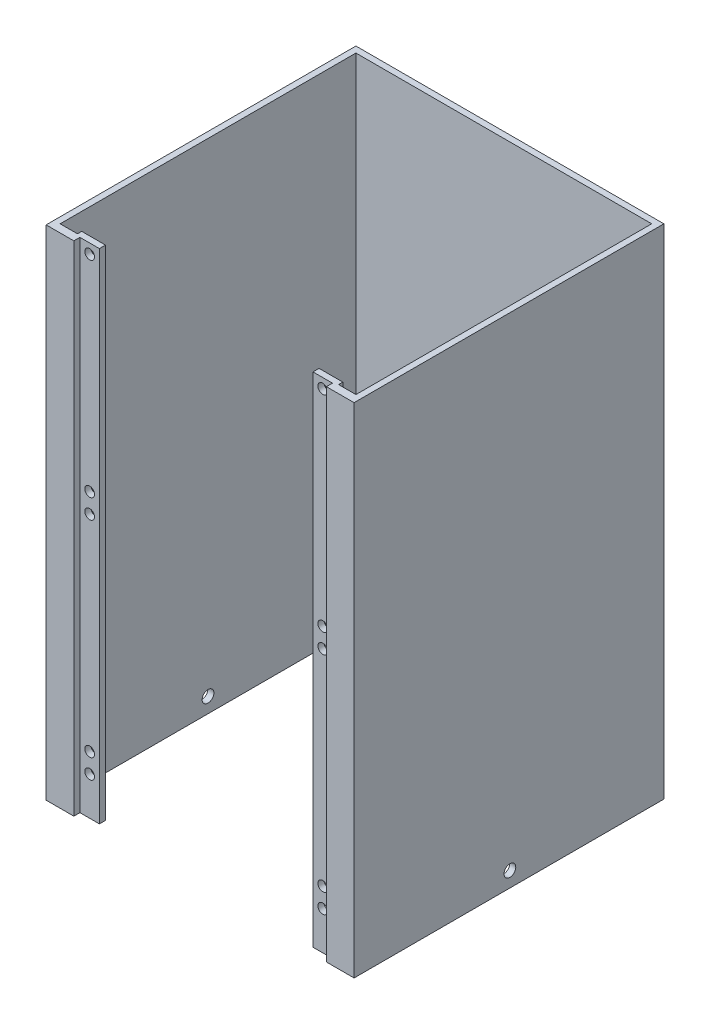
ISO-10303-21;
HEADER;
FILE_DESCRIPTION(('STEP AP214'),'2;1');
FILE_NAME('part.step','',(''),(''),'','','');
FILE_SCHEMA(('AUTOMOTIVE_DESIGN { 1 0 10303 214 1 1 1 1 }'));
ENDSEC;
DATA;
#1=APPLICATION_CONTEXT('core data for automotive mechanical design processes');
#2=APPLICATION_PROTOCOL_DEFINITION('international standard','automotive_design',2000,#1);
#3=PRODUCT_CONTEXT('',#1,'mechanical');
#4=PRODUCT('Part','Part','',(#3));
#5=PRODUCT_RELATED_PRODUCT_CATEGORY('part','',(#4));
#6=PRODUCT_DEFINITION_FORMATION('','',#4);
#7=PRODUCT_DEFINITION_CONTEXT('part definition',#1,'design');
#8=PRODUCT_DEFINITION('design','',#6,#7);
#9=PRODUCT_DEFINITION_SHAPE('','',#8);
#10=(LENGTH_UNIT() NAMED_UNIT(*) SI_UNIT(.MILLI.,.METRE.));
#11=(NAMED_UNIT(*) PLANE_ANGLE_UNIT() SI_UNIT($,.RADIAN.));
#12=(NAMED_UNIT(*) SI_UNIT($,.STERADIAN.) SOLID_ANGLE_UNIT());
#13=UNCERTAINTY_MEASURE_WITH_UNIT(LENGTH_MEASURE(1.E-05),#10,'distance_accuracy_value','');
#14=(GEOMETRIC_REPRESENTATION_CONTEXT(3) GLOBAL_UNCERTAINTY_ASSIGNED_CONTEXT((#13)) GLOBAL_UNIT_ASSIGNED_CONTEXT((#10,
#11,#12)) REPRESENTATION_CONTEXT('',''));
#15=CARTESIAN_POINT('',(0.,0.,0.));
#16=DIRECTION('',(0.,0.,1.));
#17=DIRECTION('',(1.,0.,0.));
#18=AXIS2_PLACEMENT_3D('',#15,#16,#17);
#19=CARTESIAN_POINT('',(9.706,327.5,0.603000000000007));
#20=DIRECTION('',(0.,0.,-1.));
#21=DIRECTION('',(-1.,0.,0.));
#22=AXIS2_PLACEMENT_3D('',#19,#20,#21);
#23=PLANE('',#22);
#24=DIRECTION('',(1.,0.,0.));
#25=VECTOR('',#24,1.);
#26=CARTESIAN_POINT('',(9.706,0.,0.603000000000007));
#27=LINE('',#26,#25);
#28=CARTESIAN_POINT('',(0.,0.,0.603000000000009));
#29=VERTEX_POINT('',#28);
#30=CARTESIAN_POINT('',(9.10300000000001,0.,0.603000000000007));
#31=VERTEX_POINT('',#30);
#32=EDGE_CURVE('E186',#29,#31,#27,.T.);
#33=ORIENTED_EDGE('',*,*,#32,.T.);
#34=DIRECTION('',(0.,1.,0.));
#35=VECTOR('',#34,1.);
#36=CARTESIAN_POINT('',(9.10300000000001,-39.2500000000001,0.603000000000007));
#37=LINE('',#36,#35);
#38=CARTESIAN_POINT('',(9.10300000000001,163.75,0.603000000000007));
#39=VERTEX_POINT('',#38);
#40=EDGE_CURVE('E174',#31,#39,#37,.T.);
#41=ORIENTED_EDGE('',*,*,#40,.T.);
#42=DIRECTION('',(-1.,0.,0.));
#43=VECTOR('',#42,1.);
#44=CARTESIAN_POINT('',(9.706,163.75,0.603000000000007));
#45=LINE('',#44,#43);
#46=CARTESIAN_POINT('',(0.,163.75,0.603000000000008));
#47=VERTEX_POINT('',#46);
#48=EDGE_CURVE('E183',#39,#47,#45,.T.);
#49=ORIENTED_EDGE('',*,*,#48,.T.);
#50=DIRECTION('',(0.,-1.,0.));
#51=VECTOR('',#50,1.);
#52=CARTESIAN_POINT('',(0.,327.5,0.603000000000009));
#53=LINE('',#52,#51);
#54=EDGE_CURVE('E285',#47,#29,#53,.T.);
#55=ORIENTED_EDGE('',*,*,#54,.T.);
#56=EDGE_LOOP('',(#33,#41,#49,#55));
#57=FACE_BOUND('',#56,.T.);
#58=ADVANCED_FACE('F35',(#57),#23,.F.);
#59=CARTESIAN_POINT('',(15.503,327.5,-3.39699999999999));
#60=DIRECTION('',(-1.,0.,0.));
#61=DIRECTION('',(0.,0.,1.));
#62=AXIS2_PLACEMENT_3D('',#59,#60,#61);
#63=PLANE('',#62);
#64=DIRECTION('',(0.,0.,1.));
#65=VECTOR('',#64,1.);
#66=CARTESIAN_POINT('',(15.503,163.75,-3.39699999999999));
#67=LINE('',#66,#65);
#68=CARTESIAN_POINT('',(15.503,163.75,-3.39699999999999));
#69=VERTEX_POINT('',#68);
#70=CARTESIAN_POINT('',(15.503,163.75,-1.4));
#71=VERTEX_POINT('',#70);
#72=EDGE_CURVE('E194',#69,#71,#67,.T.);
#73=ORIENTED_EDGE('',*,*,#72,.T.);
#74=DIRECTION('',(0.,-1.,0.));
#75=VECTOR('',#74,1.);
#76=CARTESIAN_POINT('',(15.503,327.5,-1.4));
#77=LINE('',#76,#75);
#78=CARTESIAN_POINT('',(15.503,0.,-1.4));
#79=VERTEX_POINT('',#78);
#80=EDGE_CURVE('E57',#71,#79,#77,.T.);
#81=ORIENTED_EDGE('',*,*,#80,.T.);
#82=DIRECTION('',(0.,0.,-1.));
#83=VECTOR('',#82,1.);
#84=CARTESIAN_POINT('',(15.503,0.,-3.39699999999999));
#85=LINE('',#84,#83);
#86=CARTESIAN_POINT('',(15.503,0.,-3.39699999999999));
#87=VERTEX_POINT('',#86);
#88=EDGE_CURVE('E240',#79,#87,#85,.T.);
#89=ORIENTED_EDGE('',*,*,#88,.T.);
#90=DIRECTION('',(0.,-1.,0.));
#91=VECTOR('',#90,1.);
#92=CARTESIAN_POINT('',(15.503,327.5,-3.39699999999999));
#93=LINE('',#92,#91);
#94=EDGE_CURVE('E314',#69,#87,#93,.T.);
#95=ORIENTED_EDGE('',*,*,#94,.F.);
#96=EDGE_LOOP('',(#73,#81,#89,#95));
#97=FACE_BOUND('',#96,.T.);
#98=ADVANCED_FACE('F391',(#97),#63,.F.);
#99=CARTESIAN_POINT('',(7.706,327.5,-3.39699999999999));
#100=DIRECTION('',(0.,0.,1.));
#101=DIRECTION('',(1.,0.,0.));
#102=AXIS2_PLACEMENT_3D('',#99,#100,#101);
#103=PLANE('',#102);
#104=CARTESIAN_POINT('',(12.303,12.5999999999999,-3.39699999999999));
#105=DIRECTION('',(0.,0.,1.));
#106=DIRECTION('',(1.,0.,0.));
#107=AXIS2_PLACEMENT_3D('',#104,#105,#106);
#108=CIRCLE('',#107,1.59999999999999);
#109=CARTESIAN_POINT('',(13.903,12.5999999999999,-3.39699999999999));
#110=VERTEX_POINT('',#109);
#111=EDGE_CURVE('E224',#110,#110,#108,.T.);
#112=ORIENTED_EDGE('',*,*,#111,.T.);
#113=EDGE_LOOP('',(#112));
#114=FACE_BOUND('',#113,.T.);
#115=CARTESIAN_POINT('',(12.303,19.,-3.39699999999999));
#116=DIRECTION('',(0.,0.,1.));
#117=DIRECTION('',(1.,0.,0.));
#118=AXIS2_PLACEMENT_3D('',#115,#116,#117);
#119=CIRCLE('',#118,1.59999999999999);
#120=CARTESIAN_POINT('',(13.903,19.,-3.39699999999999));
#121=VERTEX_POINT('',#120);
#122=EDGE_CURVE('E330',#121,#121,#119,.T.);
#123=ORIENTED_EDGE('',*,*,#122,.T.);
#124=EDGE_LOOP('',(#123));
#125=FACE_BOUND('',#124,.T.);
#126=CARTESIAN_POINT('',(12.303,86.575,-3.39699999999999));
#127=DIRECTION('',(0.,0.,1.));
#128=DIRECTION('',(1.,0.,0.));
#129=AXIS2_PLACEMENT_3D('',#126,#127,#128);
#130=CIRCLE('',#129,1.6);
#131=CARTESIAN_POINT('',(13.903,86.575,-3.39699999999999));
#132=VERTEX_POINT('',#131);
#133=EDGE_CURVE('E233',#132,#132,#130,.T.);
#134=ORIENTED_EDGE('',*,*,#133,.T.);
#135=EDGE_LOOP('',(#134));
#136=FACE_BOUND('',#135,.T.);
#137=CARTESIAN_POINT('',(12.303,92.975,-3.39699999999999));
#138=DIRECTION('',(0.,0.,1.));
#139=DIRECTION('',(1.,0.,0.));
#140=AXIS2_PLACEMENT_3D('',#137,#138,#139);
#141=CIRCLE('',#140,1.6);
#142=CARTESIAN_POINT('',(13.903,92.975,-3.39699999999999));
#143=VERTEX_POINT('',#142);
#144=EDGE_CURVE('E321',#143,#143,#141,.T.);
#145=ORIENTED_EDGE('',*,*,#144,.T.);
#146=EDGE_LOOP('',(#145));
#147=FACE_BOUND('',#146,.T.);
#148=CARTESIAN_POINT('',(12.303,160.55,-3.39699999999999));
#149=DIRECTION('',(0.,0.,1.));
#150=DIRECTION('',(1.,0.,0.));
#151=AXIS2_PLACEMENT_3D('',#148,#149,#150);
#152=CIRCLE('',#151,1.59999999999999);
#153=CARTESIAN_POINT('',(13.903,160.55,-3.39699999999999));
#154=VERTEX_POINT('',#153);
#155=EDGE_CURVE('E237',#154,#154,#152,.T.);
#156=ORIENTED_EDGE('',*,*,#155,.T.);
#157=EDGE_LOOP('',(#156));
#158=FACE_BOUND('',#157,.T.);
#159=DIRECTION('',(0.,-1.,0.));
#160=VECTOR('',#159,1.);
#161=CARTESIAN_POINT('',(7.706,327.5,-3.39699999999999));
#162=LINE('',#161,#160);
#163=CARTESIAN_POINT('',(7.706,163.75,-3.39699999999999));
#164=VERTEX_POINT('',#163);
#165=CARTESIAN_POINT('',(7.706,0.,-3.39699999999999));
#166=VERTEX_POINT('',#165);
#167=EDGE_CURVE('E312',#164,#166,#162,.T.);
#168=ORIENTED_EDGE('',*,*,#167,.F.);
#169=DIRECTION('',(1.,0.,0.));
#170=VECTOR('',#169,1.);
#171=CARTESIAN_POINT('',(7.706,163.75,-3.39699999999999));
#172=LINE('',#171,#170);
#173=EDGE_CURVE('E200',#164,#69,#172,.T.);
#174=ORIENTED_EDGE('',*,*,#173,.T.);
#175=ORIENTED_EDGE('',*,*,#94,.T.);
#176=DIRECTION('',(-1.,0.,0.));
#177=VECTOR('',#176,1.);
#178=CARTESIAN_POINT('',(7.706,0.,-3.39699999999999));
#179=LINE('',#178,#177);
#180=EDGE_CURVE('E242',#87,#166,#179,.T.);
#181=ORIENTED_EDGE('',*,*,#180,.T.);
#182=EDGE_LOOP('',(#168,#174,#175,#181));
#183=FACE_BOUND('',#182,.T.);
#184=ADVANCED_FACE('F388',(#114,#125,#136,#147,#158,#183),#103,.F.);
#185=CARTESIAN_POINT('',(7.706,327.5,-2.));
#186=DIRECTION('',(1.,0.,0.));
#187=DIRECTION('',(0.,0.,-1.));
#188=AXIS2_PLACEMENT_3D('',#185,#186,#187);
#189=PLANE('',#188);
#190=DIRECTION('',(0.,-1.,0.));
#191=VECTOR('',#190,1.);
#192=CARTESIAN_POINT('',(7.706,327.5,-2.));
#193=LINE('',#192,#191);
#194=CARTESIAN_POINT('',(7.706,163.75,-2.));
#195=VERTEX_POINT('',#194);
#196=CARTESIAN_POINT('',(7.706,0.,-2.));
#197=VERTEX_POINT('',#196);
#198=EDGE_CURVE('E310',#195,#197,#193,.T.);
#199=ORIENTED_EDGE('',*,*,#198,.F.);
#200=DIRECTION('',(0.,0.,-1.));
#201=VECTOR('',#200,1.);
#202=CARTESIAN_POINT('',(7.706,163.75,-2.));
#203=LINE('',#202,#201);
#204=EDGE_CURVE('E382',#195,#164,#203,.T.);
#205=ORIENTED_EDGE('',*,*,#204,.T.);
#206=ORIENTED_EDGE('',*,*,#167,.T.);
#207=DIRECTION('',(0.,0.,1.));
#208=VECTOR('',#207,1.);
#209=CARTESIAN_POINT('',(7.706,0.,-2.));
#210=LINE('',#209,#208);
#211=EDGE_CURVE('E245',#166,#197,#210,.T.);
#212=ORIENTED_EDGE('',*,*,#211,.T.);
#213=EDGE_LOOP('',(#199,#205,#206,#212));
#214=FACE_BOUND('',#213,.T.);
#215=ADVANCED_FACE('F402',(#214),#189,.F.);
#216=CARTESIAN_POINT('',(2.00000000000001,327.5,-2.));
#217=DIRECTION('',(0.,0.,1.));
#218=DIRECTION('',(1.,0.,0.));
#219=AXIS2_PLACEMENT_3D('',#216,#217,#218);
#220=PLANE('',#219);
#221=DIRECTION('',(0.,-1.,0.));
#222=VECTOR('',#221,1.);
#223=CARTESIAN_POINT('',(2.00000000000001,327.5,-2.));
#224=LINE('',#223,#222);
#225=CARTESIAN_POINT('',(2.00000000000001,163.75,-2.));
#226=VERTEX_POINT('',#225);
#227=CARTESIAN_POINT('',(2.00000000000001,0.,-2.));
#228=VERTEX_POINT('',#227);
#229=EDGE_CURVE('E308',#226,#228,#224,.T.);
#230=ORIENTED_EDGE('',*,*,#229,.F.);
#231=DIRECTION('',(1.,0.,0.));
#232=VECTOR('',#231,1.);
#233=CARTESIAN_POINT('',(2.00000000000001,163.75,-2.));
#234=LINE('',#233,#232);
#235=EDGE_CURVE('E379',#226,#195,#234,.T.);
#236=ORIENTED_EDGE('',*,*,#235,.T.);
#237=ORIENTED_EDGE('',*,*,#198,.T.);
#238=DIRECTION('',(-1.,0.,0.));
#239=VECTOR('',#238,1.);
#240=CARTESIAN_POINT('',(2.00000000000001,0.,-2.));
#241=LINE('',#240,#239);
#242=EDGE_CURVE('E248',#197,#228,#241,.T.);
#243=ORIENTED_EDGE('',*,*,#242,.T.);
#244=EDGE_LOOP('',(#230,#236,#237,#243));
#245=FACE_BOUND('',#244,.T.);
#246=ADVANCED_FACE('F405',(#245),#220,.F.);
#247=CARTESIAN_POINT('',(2.,327.5,-99.206));
#248=DIRECTION('',(-1.,0.,0.));
#249=DIRECTION('',(0.,0.,1.));
#250=AXIS2_PLACEMENT_3D('',#247,#248,#249);
#251=PLANE('',#250);
#252=CARTESIAN_POINT('',(2.00000000000001,4.97599999999998,-50.603));
#253=DIRECTION('',(-1.,0.,0.));
#254=DIRECTION('',(0.,0.,1.));
#255=AXIS2_PLACEMENT_3D('',#252,#253,#254);
#256=CIRCLE('',#255,1.93);
#257=CARTESIAN_POINT('',(2.00000000000001,4.97599999999998,-48.673));
#258=VERTEX_POINT('',#257);
#259=EDGE_CURVE('E213',#258,#258,#256,.T.);
#260=ORIENTED_EDGE('',*,*,#259,.T.);
#261=EDGE_LOOP('',(#260));
#262=FACE_BOUND('',#261,.T.);
#263=DIRECTION('',(0.,-1.,0.));
#264=VECTOR('',#263,1.);
#265=CARTESIAN_POINT('',(2.,327.5,-99.206));
#266=LINE('',#265,#264);
#267=CARTESIAN_POINT('',(2.,163.75,-99.206));
#268=VERTEX_POINT('',#267);
#269=CARTESIAN_POINT('',(2.,0.,-99.206));
#270=VERTEX_POINT('',#269);
#271=EDGE_CURVE('E306',#268,#270,#266,.T.);
#272=ORIENTED_EDGE('',*,*,#271,.F.);
#273=DIRECTION('',(0.,0.,1.));
#274=VECTOR('',#273,1.);
#275=CARTESIAN_POINT('',(2.,163.75,-99.206));
#276=LINE('',#275,#274);
#277=EDGE_CURVE('E376',#268,#226,#276,.T.);
#278=ORIENTED_EDGE('',*,*,#277,.T.);
#279=ORIENTED_EDGE('',*,*,#229,.T.);
#280=DIRECTION('',(0.,0.,-1.));
#281=VECTOR('',#280,1.);
#282=CARTESIAN_POINT('',(2.,0.,-99.206));
#283=LINE('',#282,#281);
#284=EDGE_CURVE('E251',#228,#270,#283,.T.);
#285=ORIENTED_EDGE('',*,*,#284,.T.);
#286=EDGE_LOOP('',(#272,#278,#279,#285));
#287=FACE_BOUND('',#286,.T.);
#288=ADVANCED_FACE('F408',(#262,#287),#251,.F.);
#289=CARTESIAN_POINT('',(99.206,327.5,-99.206));
#290=DIRECTION('',(0.,0.,-1.));
#291=DIRECTION('',(-1.,0.,0.));
#292=AXIS2_PLACEMENT_3D('',#289,#290,#291);
#293=PLANE('',#292);
#294=CARTESIAN_POINT('',(50.603,4.97599999999998,-99.206));
#295=DIRECTION('',(0.,0.,-1.));
#296=DIRECTION('',(-1.,0.,0.));
#297=AXIS2_PLACEMENT_3D('',#294,#295,#296);
#298=CIRCLE('',#297,1.93);
#299=CARTESIAN_POINT('',(48.673,4.97599999999998,-99.206));
#300=VERTEX_POINT('',#299);
#301=EDGE_CURVE('E197',#300,#300,#298,.T.);
#302=ORIENTED_EDGE('',*,*,#301,.T.);
#303=EDGE_LOOP('',(#302));
#304=FACE_BOUND('',#303,.T.);
#305=DIRECTION('',(0.,-1.,0.));
#306=VECTOR('',#305,1.);
#307=CARTESIAN_POINT('',(99.206,327.5,-99.206));
#308=LINE('',#307,#306);
#309=CARTESIAN_POINT('',(99.206,163.75,-99.206));
#310=VERTEX_POINT('',#309);
#311=CARTESIAN_POINT('',(99.206,0.,-99.206));
#312=VERTEX_POINT('',#311);
#313=EDGE_CURVE('E304',#310,#312,#308,.T.);
#314=ORIENTED_EDGE('',*,*,#313,.F.);
#315=DIRECTION('',(-1.,0.,0.));
#316=VECTOR('',#315,1.);
#317=CARTESIAN_POINT('',(99.206,163.75,-99.206));
#318=LINE('',#317,#316);
#319=EDGE_CURVE('E373',#310,#268,#318,.T.);
#320=ORIENTED_EDGE('',*,*,#319,.T.);
#321=ORIENTED_EDGE('',*,*,#271,.T.);
#322=DIRECTION('',(1.,0.,0.));
#323=VECTOR('',#322,1.);
#324=CARTESIAN_POINT('',(99.206,0.,-99.206));
#325=LINE('',#324,#323);
#326=EDGE_CURVE('E254',#270,#312,#325,.T.);
#327=ORIENTED_EDGE('',*,*,#326,.T.);
#328=EDGE_LOOP('',(#314,#320,#321,#327));
#329=FACE_BOUND('',#328,.T.);
#330=ADVANCED_FACE('F412',(#304,#329),#293,.F.);
#331=CARTESIAN_POINT('',(99.206,327.5,-2.));
#332=DIRECTION('',(1.,0.,0.));
#333=DIRECTION('',(0.,0.,-1.));
#334=AXIS2_PLACEMENT_3D('',#331,#332,#333);
#335=PLANE('',#334);
#336=CARTESIAN_POINT('',(99.206,4.97599999999998,-50.603));
#337=DIRECTION('',(1.,0.,0.));
#338=DIRECTION('',(0.,0.,-1.));
#339=AXIS2_PLACEMENT_3D('',#336,#337,#338);
#340=CIRCLE('',#339,1.93);
#341=CARTESIAN_POINT('',(99.206,4.97599999999998,-52.533));
#342=VERTEX_POINT('',#341);
#343=EDGE_CURVE('E210',#342,#342,#340,.T.);
#344=ORIENTED_EDGE('',*,*,#343,.T.);
#345=EDGE_LOOP('',(#344));
#346=FACE_BOUND('',#345,.T.);
#347=DIRECTION('',(0.,-1.,0.));
#348=VECTOR('',#347,1.);
#349=CARTESIAN_POINT('',(99.206,327.5,-2.));
#350=LINE('',#349,#348);
#351=CARTESIAN_POINT('',(99.206,163.75,-2.));
#352=VERTEX_POINT('',#351);
#353=CARTESIAN_POINT('',(99.206,0.,-2.));
#354=VERTEX_POINT('',#353);
#355=EDGE_CURVE('E302',#352,#354,#350,.T.);
#356=ORIENTED_EDGE('',*,*,#355,.F.);
#357=DIRECTION('',(0.,0.,-1.));
#358=VECTOR('',#357,1.);
#359=CARTESIAN_POINT('',(99.206,163.75,-2.));
#360=LINE('',#359,#358);
#361=EDGE_CURVE('E370',#352,#310,#360,.T.);
#362=ORIENTED_EDGE('',*,*,#361,.T.);
#363=ORIENTED_EDGE('',*,*,#313,.T.);
#364=DIRECTION('',(0.,0.,1.));
#365=VECTOR('',#364,1.);
#366=CARTESIAN_POINT('',(99.206,0.,-2.));
#367=LINE('',#366,#365);
#368=EDGE_CURVE('E257',#312,#354,#367,.T.);
#369=ORIENTED_EDGE('',*,*,#368,.T.);
#370=EDGE_LOOP('',(#356,#362,#363,#369));
#371=FACE_BOUND('',#370,.T.);
#372=ADVANCED_FACE('F416',(#346,#371),#335,.F.);
#373=CARTESIAN_POINT('',(93.5,327.5,-2.));
#374=DIRECTION('',(0.,0.,1.));
#375=DIRECTION('',(1.,0.,0.));
#376=AXIS2_PLACEMENT_3D('',#373,#374,#375);
#377=PLANE('',#376);
#378=DIRECTION('',(0.,-1.,0.));
#379=VECTOR('',#378,1.);
#380=CARTESIAN_POINT('',(93.5,327.5,-2.));
#381=LINE('',#380,#379);
#382=CARTESIAN_POINT('',(93.5,163.75,-2.));
#383=VERTEX_POINT('',#382);
#384=CARTESIAN_POINT('',(93.5,0.,-2.));
#385=VERTEX_POINT('',#384);
#386=EDGE_CURVE('E300',#383,#385,#381,.T.);
#387=ORIENTED_EDGE('',*,*,#386,.F.);
#388=DIRECTION('',(1.,0.,0.));
#389=VECTOR('',#388,1.);
#390=CARTESIAN_POINT('',(93.5,163.75,-2.));
#391=LINE('',#390,#389);
#392=EDGE_CURVE('E367',#383,#352,#391,.T.);
#393=ORIENTED_EDGE('',*,*,#392,.T.);
#394=ORIENTED_EDGE('',*,*,#355,.T.);
#395=DIRECTION('',(-1.,0.,0.));
#396=VECTOR('',#395,1.);
#397=CARTESIAN_POINT('',(93.5,0.,-2.));
#398=LINE('',#397,#396);
#399=EDGE_CURVE('E260',#354,#385,#398,.T.);
#400=ORIENTED_EDGE('',*,*,#399,.T.);
#401=EDGE_LOOP('',(#387,#393,#394,#400));
#402=FACE_BOUND('',#401,.T.);
#403=ADVANCED_FACE('F420',(#402),#377,.F.);
#404=CARTESIAN_POINT('',(93.5,327.5,-3.4));
#405=DIRECTION('',(-1.,0.,0.));
#406=DIRECTION('',(0.,0.,1.));
#407=AXIS2_PLACEMENT_3D('',#404,#405,#406);
#408=PLANE('',#407);
#409=DIRECTION('',(0.,-1.,0.));
#410=VECTOR('',#409,1.);
#411=CARTESIAN_POINT('',(93.5,327.5,-3.4));
#412=LINE('',#411,#410);
#413=CARTESIAN_POINT('',(93.5,163.75,-3.4));
#414=VERTEX_POINT('',#413);
#415=CARTESIAN_POINT('',(93.5,0.,-3.4));
#416=VERTEX_POINT('',#415);
#417=EDGE_CURVE('E298',#414,#416,#412,.T.);
#418=ORIENTED_EDGE('',*,*,#417,.F.);
#419=DIRECTION('',(0.,0.,1.));
#420=VECTOR('',#419,1.);
#421=CARTESIAN_POINT('',(93.5,163.75,-3.4));
#422=LINE('',#421,#420);
#423=EDGE_CURVE('E364',#414,#383,#422,.T.);
#424=ORIENTED_EDGE('',*,*,#423,.T.);
#425=ORIENTED_EDGE('',*,*,#386,.T.);
#426=DIRECTION('',(0.,0.,-1.));
#427=VECTOR('',#426,1.);
#428=CARTESIAN_POINT('',(93.5,0.,-3.4));
#429=LINE('',#428,#427);
#430=EDGE_CURVE('E263',#385,#416,#429,.T.);
#431=ORIENTED_EDGE('',*,*,#430,.T.);
#432=EDGE_LOOP('',(#418,#424,#425,#431));
#433=FACE_BOUND('',#432,.T.);
#434=ADVANCED_FACE('F424',(#433),#408,.F.);
#435=CARTESIAN_POINT('',(85.703,327.5,-3.4));
#436=DIRECTION('',(0.,0.,1.));
#437=DIRECTION('',(1.,0.,0.));
#438=AXIS2_PLACEMENT_3D('',#435,#436,#437);
#439=PLANE('',#438);
#440=CARTESIAN_POINT('',(88.903,12.6,-3.4));
#441=DIRECTION('',(0.,0.,1.));
#442=DIRECTION('',(1.,0.,0.));
#443=AXIS2_PLACEMENT_3D('',#440,#441,#442);
#444=CIRCLE('',#443,1.59999999999999);
#445=CARTESIAN_POINT('',(90.503,12.6,-3.4));
#446=VERTEX_POINT('',#445);
#447=EDGE_CURVE('E217',#446,#446,#444,.T.);
#448=ORIENTED_EDGE('',*,*,#447,.T.);
#449=EDGE_LOOP('',(#448));
#450=FACE_BOUND('',#449,.T.);
#451=CARTESIAN_POINT('',(88.903,19.,-3.4));
#452=DIRECTION('',(0.,0.,1.));
#453=DIRECTION('',(1.,0.,0.));
#454=AXIS2_PLACEMENT_3D('',#451,#452,#453);
#455=CIRCLE('',#454,1.59999999999999);
#456=CARTESIAN_POINT('',(90.503,19.,-3.4));
#457=VERTEX_POINT('',#456);
#458=EDGE_CURVE('E221',#457,#457,#455,.T.);
#459=ORIENTED_EDGE('',*,*,#458,.T.);
#460=EDGE_LOOP('',(#459));
#461=FACE_BOUND('',#460,.T.);
#462=CARTESIAN_POINT('',(88.903,86.575,-3.4));
#463=DIRECTION('',(0.,0.,1.));
#464=DIRECTION('',(1.,0.,0.));
#465=AXIS2_PLACEMENT_3D('',#462,#463,#464);
#466=CIRCLE('',#465,1.59999999999999);
#467=CARTESIAN_POINT('',(90.503,86.575,-3.4));
#468=VERTEX_POINT('',#467);
#469=EDGE_CURVE('E225',#468,#468,#466,.T.);
#470=ORIENTED_EDGE('',*,*,#469,.T.);
#471=EDGE_LOOP('',(#470));
#472=FACE_BOUND('',#471,.T.);
#473=CARTESIAN_POINT('',(88.903,92.975,-3.4));
#474=DIRECTION('',(0.,0.,1.));
#475=DIRECTION('',(1.,0.,0.));
#476=AXIS2_PLACEMENT_3D('',#473,#474,#475);
#477=CIRCLE('',#476,1.59999999999999);
#478=CARTESIAN_POINT('',(90.503,92.975,-3.4));
#479=VERTEX_POINT('',#478);
#480=EDGE_CURVE('E230',#479,#479,#477,.T.);
#481=ORIENTED_EDGE('',*,*,#480,.T.);
#482=EDGE_LOOP('',(#481));
#483=FACE_BOUND('',#482,.T.);
#484=CARTESIAN_POINT('',(88.903,160.55,-3.4));
#485=DIRECTION('',(0.,0.,1.));
#486=DIRECTION('',(1.,0.,0.));
#487=AXIS2_PLACEMENT_3D('',#484,#485,#486);
#488=CIRCLE('',#487,1.59999999999999);
#489=CARTESIAN_POINT('',(90.503,160.55,-3.4));
#490=VERTEX_POINT('',#489);
#491=EDGE_CURVE('E234',#490,#490,#488,.T.);
#492=ORIENTED_EDGE('',*,*,#491,.T.);
#493=EDGE_LOOP('',(#492));
#494=FACE_BOUND('',#493,.T.);
#495=DIRECTION('',(0.,-1.,0.));
#496=VECTOR('',#495,1.);
#497=CARTESIAN_POINT('',(85.703,327.5,-3.4));
#498=LINE('',#497,#496);
#499=CARTESIAN_POINT('',(85.703,163.75,-3.4));
#500=VERTEX_POINT('',#499);
#501=CARTESIAN_POINT('',(85.703,0.,-3.4));
#502=VERTEX_POINT('',#501);
#503=EDGE_CURVE('E296',#500,#502,#498,.T.);
#504=ORIENTED_EDGE('',*,*,#503,.F.);
#505=DIRECTION('',(1.,0.,0.));
#506=VECTOR('',#505,1.);
#507=CARTESIAN_POINT('',(85.703,163.75,-3.4));
#508=LINE('',#507,#506);
#509=EDGE_CURVE('E361',#500,#414,#508,.T.);
#510=ORIENTED_EDGE('',*,*,#509,.T.);
#511=ORIENTED_EDGE('',*,*,#417,.T.);
#512=DIRECTION('',(-1.,0.,0.));
#513=VECTOR('',#512,1.);
#514=CARTESIAN_POINT('',(85.703,0.,-3.4));
#515=LINE('',#514,#513);
#516=EDGE_CURVE('E266',#416,#502,#515,.T.);
#517=ORIENTED_EDGE('',*,*,#516,.T.);
#518=EDGE_LOOP('',(#504,#510,#511,#517));
#519=FACE_BOUND('',#518,.T.);
#520=ADVANCED_FACE('F428',(#450,#461,#472,#483,#494,#519),#439,.F.);
#521=CARTESIAN_POINT('',(85.703,327.5,-1.4));
#522=DIRECTION('',(1.,0.,0.));
#523=DIRECTION('',(0.,0.,-1.));
#524=AXIS2_PLACEMENT_3D('',#521,#522,#523);
#525=PLANE('',#524);
#526=DIRECTION('',(0.,-1.,0.));
#527=VECTOR('',#526,1.);
#528=CARTESIAN_POINT('',(85.703,327.5,-1.4));
#529=LINE('',#528,#527);
#530=CARTESIAN_POINT('',(85.703,163.75,-1.4));
#531=VERTEX_POINT('',#530);
#532=CARTESIAN_POINT('',(85.703,0.,-1.4));
#533=VERTEX_POINT('',#532);
#534=EDGE_CURVE('E294',#531,#533,#529,.T.);
#535=ORIENTED_EDGE('',*,*,#534,.F.);
#536=DIRECTION('',(0.,0.,-1.));
#537=VECTOR('',#536,1.);
#538=CARTESIAN_POINT('',(85.703,163.75,-1.4));
#539=LINE('',#538,#537);
#540=EDGE_CURVE('E353',#531,#500,#539,.T.);
#541=ORIENTED_EDGE('',*,*,#540,.T.);
#542=ORIENTED_EDGE('',*,*,#503,.T.);
#543=DIRECTION('',(0.,0.,1.));
#544=VECTOR('',#543,1.);
#545=CARTESIAN_POINT('',(85.703,0.,-1.4));
#546=LINE('',#545,#544);
#547=EDGE_CURVE('E269',#502,#533,#546,.T.);
#548=ORIENTED_EDGE('',*,*,#547,.T.);
#549=EDGE_LOOP('',(#535,#541,#542,#548));
#550=FACE_BOUND('',#549,.T.);
#551=ADVANCED_FACE('F432',(#550),#525,.F.);
#552=CARTESIAN_POINT('',(91.5,327.5,-1.4));
#553=DIRECTION('',(0.,0.,-1.));
#554=DIRECTION('',(-1.,0.,0.));
#555=AXIS2_PLACEMENT_3D('',#552,#553,#554);
#556=PLANE('',#555);
#557=CARTESIAN_POINT('',(88.903,12.6,-1.4));
#558=DIRECTION('',(0.,0.,-1.));
#559=DIRECTION('',(-1.,0.,0.));
#560=AXIS2_PLACEMENT_3D('',#557,#558,#559);
#561=CIRCLE('',#560,1.59999999999999);
#562=CARTESIAN_POINT('',(87.303,12.6,-1.4));
#563=VERTEX_POINT('',#562);
#564=EDGE_CURVE('E216',#563,#563,#561,.T.);
#565=ORIENTED_EDGE('',*,*,#564,.T.);
#566=EDGE_LOOP('',(#565));
#567=FACE_BOUND('',#566,.T.);
#568=CARTESIAN_POINT('',(88.903,19.,-1.4));
#569=DIRECTION('',(0.,0.,-1.));
#570=DIRECTION('',(-1.,0.,0.));
#571=AXIS2_PLACEMENT_3D('',#568,#569,#570);
#572=CIRCLE('',#571,1.59999999999999);
#573=CARTESIAN_POINT('',(87.303,19.,-1.4));
#574=VERTEX_POINT('',#573);
#575=EDGE_CURVE('E220',#574,#574,#572,.T.);
#576=ORIENTED_EDGE('',*,*,#575,.T.);
#577=EDGE_LOOP('',(#576));
#578=FACE_BOUND('',#577,.T.);
#579=CARTESIAN_POINT('',(88.903,86.575,-1.4));
#580=DIRECTION('',(0.,0.,-1.));
#581=DIRECTION('',(-1.,0.,0.));
#582=AXIS2_PLACEMENT_3D('',#579,#580,#581);
#583=CIRCLE('',#582,1.59999999999999);
#584=CARTESIAN_POINT('',(87.303,86.575,-1.4));
#585=VERTEX_POINT('',#584);
#586=EDGE_CURVE('E229',#585,#585,#583,.T.);
#587=ORIENTED_EDGE('',*,*,#586,.T.);
#588=EDGE_LOOP('',(#587));
#589=FACE_BOUND('',#588,.T.);
#590=CARTESIAN_POINT('',(88.903,92.975,-1.4));
#591=DIRECTION('',(0.,0.,-1.));
#592=DIRECTION('',(-1.,0.,0.));
#593=AXIS2_PLACEMENT_3D('',#590,#591,#592);
#594=CIRCLE('',#593,1.59999999999999);
#595=CARTESIAN_POINT('',(87.303,92.975,-1.4));
#596=VERTEX_POINT('',#595);
#597=EDGE_CURVE('E228',#596,#596,#594,.T.);
#598=ORIENTED_EDGE('',*,*,#597,.T.);
#599=EDGE_LOOP('',(#598));
#600=FACE_BOUND('',#599,.T.);
#601=CARTESIAN_POINT('',(88.903,160.55,-1.4));
#602=DIRECTION('',(0.,0.,-1.));
#603=DIRECTION('',(-1.,0.,0.));
#604=AXIS2_PLACEMENT_3D('',#601,#602,#603);
#605=CIRCLE('',#604,1.59999999999999);
#606=CARTESIAN_POINT('',(87.303,160.55,-1.4));
#607=VERTEX_POINT('',#606);
#608=EDGE_CURVE('E238',#607,#607,#605,.T.);
#609=ORIENTED_EDGE('',*,*,#608,.T.);
#610=EDGE_LOOP('',(#609));
#611=FACE_BOUND('',#610,.T.);
#612=DIRECTION('',(1.,0.,0.));
#613=VECTOR('',#612,1.);
#614=CARTESIAN_POINT('',(91.5,0.,-1.4));
#615=LINE('',#614,#613);
#616=CARTESIAN_POINT('',(92.103,0.,-1.4));
#617=VERTEX_POINT('',#616);
#618=EDGE_CURVE('E272',#533,#617,#615,.T.);
#619=ORIENTED_EDGE('',*,*,#618,.T.);
#620=DIRECTION('',(0.,1.,0.));
#621=VECTOR('',#620,1.);
#622=CARTESIAN_POINT('',(92.103,-39.2500000000001,-1.4));
#623=LINE('',#622,#621);
#624=CARTESIAN_POINT('',(92.103,163.75,-1.4));
#625=VERTEX_POINT('',#624);
#626=EDGE_CURVE('E187',#617,#625,#623,.T.);
#627=ORIENTED_EDGE('',*,*,#626,.T.);
#628=DIRECTION('',(-1.,0.,0.));
#629=VECTOR('',#628,1.);
#630=CARTESIAN_POINT('',(91.5,163.75,-1.4));
#631=LINE('',#630,#629);
#632=EDGE_CURVE('E344',#625,#531,#631,.T.);
#633=ORIENTED_EDGE('',*,*,#632,.T.);
#634=ORIENTED_EDGE('',*,*,#534,.T.);
#635=EDGE_LOOP('',(#619,#627,#633,#634));
#636=FACE_BOUND('',#635,.T.);
#637=ADVANCED_FACE('F435',(#567,#578,#589,#600,#611,#636),#556,.F.);
#638=CARTESIAN_POINT('',(101.206,327.5,0.599999999999998));
#639=DIRECTION('',(0.,0.,-1.));
#640=DIRECTION('',(-1.,0.,0.));
#641=AXIS2_PLACEMENT_3D('',#638,#639,#640);
#642=PLANE('',#641);
#643=DIRECTION('',(-1.,0.,0.));
#644=VECTOR('',#643,1.);
#645=CARTESIAN_POINT('',(101.206,163.75,0.599999999999998));
#646=LINE('',#645,#644);
#647=CARTESIAN_POINT('',(101.206,163.75,0.600000000000003));
#648=VERTEX_POINT('',#647);
#649=CARTESIAN_POINT('',(92.103,163.75,0.599999999999998));
#650=VERTEX_POINT('',#649);
#651=EDGE_CURVE('E341',#648,#650,#646,.T.);
#652=ORIENTED_EDGE('',*,*,#651,.T.);
#653=DIRECTION('',(0.,-1.,0.));
#654=VECTOR('',#653,1.);
#655=CARTESIAN_POINT('',(92.103,327.5,0.599999999999998));
#656=LINE('',#655,#654);
#657=CARTESIAN_POINT('',(92.103,0.,0.599999999999998));
#658=VERTEX_POINT('',#657);
#659=EDGE_CURVE('E49',#650,#658,#656,.T.);
#660=ORIENTED_EDGE('',*,*,#659,.T.);
#661=DIRECTION('',(1.,0.,0.));
#662=VECTOR('',#661,1.);
#663=CARTESIAN_POINT('',(101.206,0.,0.599999999999998));
#664=LINE('',#663,#662);
#665=CARTESIAN_POINT('',(101.206,0.,0.599999999999998));
#666=VERTEX_POINT('',#665);
#667=EDGE_CURVE('E274',#658,#666,#664,.T.);
#668=ORIENTED_EDGE('',*,*,#667,.T.);
#669=DIRECTION('',(0.,-1.,0.));
#670=VECTOR('',#669,1.);
#671=CARTESIAN_POINT('',(101.206,327.5,0.599999999999998));
#672=LINE('',#671,#670);
#673=EDGE_CURVE('E291',#648,#666,#672,.T.);
#674=ORIENTED_EDGE('',*,*,#673,.F.);
#675=EDGE_LOOP('',(#652,#660,#668,#674));
#676=FACE_BOUND('',#675,.T.);
#677=ADVANCED_FACE('F349',(#676),#642,.F.);
#678=CARTESIAN_POINT('',(101.206,327.5,-101.206));
#679=DIRECTION('',(-1.,0.,0.));
#680=DIRECTION('',(0.,0.,1.));
#681=AXIS2_PLACEMENT_3D('',#678,#679,#680);
#682=PLANE('',#681);
#683=CARTESIAN_POINT('',(101.206,4.97599999999998,-50.603));
#684=DIRECTION('',(1.,0.,0.));
#685=DIRECTION('',(0.,0.,-1.));
#686=AXIS2_PLACEMENT_3D('',#683,#684,#685);
#687=CIRCLE('',#686,1.93);
#688=CARTESIAN_POINT('',(101.206,4.97599999999998,-52.533));
#689=VERTEX_POINT('',#688);
#690=EDGE_CURVE('E206',#689,#689,#687,.T.);
#691=ORIENTED_EDGE('',*,*,#690,.F.);
#692=EDGE_LOOP('',(#691));
#693=FACE_BOUND('',#692,.T.);
#694=DIRECTION('',(0.,-1.,0.));
#695=VECTOR('',#694,1.);
#696=CARTESIAN_POINT('',(101.206,327.5,-101.206));
#697=LINE('',#696,#695);
#698=CARTESIAN_POINT('',(101.206,163.75,-101.206));
#699=VERTEX_POINT('',#698);
#700=CARTESIAN_POINT('',(101.206,0.,-101.206));
#701=VERTEX_POINT('',#700);
#702=EDGE_CURVE('E289',#699,#701,#697,.T.);
#703=ORIENTED_EDGE('',*,*,#702,.F.);
#704=DIRECTION('',(0.,0.,1.));
#705=VECTOR('',#704,1.);
#706=CARTESIAN_POINT('',(101.206,163.75,-101.206));
#707=LINE('',#706,#705);
#708=EDGE_CURVE('E351',#699,#648,#707,.T.);
#709=ORIENTED_EDGE('',*,*,#708,.T.);
#710=ORIENTED_EDGE('',*,*,#673,.T.);
#711=DIRECTION('',(0.,0.,-1.));
#712=VECTOR('',#711,1.);
#713=CARTESIAN_POINT('',(101.206,0.,-101.206));
#714=LINE('',#713,#712);
#715=EDGE_CURVE('E276',#666,#701,#714,.T.);
#716=ORIENTED_EDGE('',*,*,#715,.T.);
#717=EDGE_LOOP('',(#703,#709,#710,#716));
#718=FACE_BOUND('',#717,.T.);
#719=ADVANCED_FACE('F522',(#693,#718),#682,.F.);
#720=CARTESIAN_POINT('',(0.,327.5,-101.206));
#721=DIRECTION('',(0.,0.,1.));
#722=DIRECTION('',(1.,0.,0.));
#723=AXIS2_PLACEMENT_3D('',#720,#721,#722);
#724=PLANE('',#723);
#725=CARTESIAN_POINT('',(50.603,4.97599999999998,-101.206));
#726=DIRECTION('',(0.,0.,-1.));
#727=DIRECTION('',(-1.,0.,0.));
#728=AXIS2_PLACEMENT_3D('',#725,#726,#727);
#729=CIRCLE('',#728,1.93);
#730=CARTESIAN_POINT('',(48.673,4.97599999999998,-101.206));
#731=VERTEX_POINT('',#730);
#732=EDGE_CURVE('E193',#731,#731,#729,.T.);
#733=ORIENTED_EDGE('',*,*,#732,.F.);
#734=EDGE_LOOP('',(#733));
#735=FACE_BOUND('',#734,.T.);
#736=DIRECTION('',(0.,-1.,0.));
#737=VECTOR('',#736,1.);
#738=CARTESIAN_POINT('',(0.,327.5,-101.206));
#739=LINE('',#738,#737);
#740=CARTESIAN_POINT('',(0.,163.75,-101.206));
#741=VERTEX_POINT('',#740);
#742=CARTESIAN_POINT('',(0.,0.,-101.206));
#743=VERTEX_POINT('',#742);
#744=EDGE_CURVE('E287',#741,#743,#739,.T.);
#745=ORIENTED_EDGE('',*,*,#744,.F.);
#746=DIRECTION('',(-1.,0.,0.));
#747=VECTOR('',#746,1.);
#748=CARTESIAN_POINT('',(191.,163.75,-101.206));
#749=LINE('',#748,#747);
#750=EDGE_CURVE('E355',#699,#741,#749,.T.);
#751=ORIENTED_EDGE('',*,*,#750,.F.);
#752=ORIENTED_EDGE('',*,*,#702,.T.);
#753=DIRECTION('',(-1.,0.,0.));
#754=VECTOR('',#753,1.);
#755=CARTESIAN_POINT('',(0.,0.,-101.206));
#756=LINE('',#755,#754);
#757=EDGE_CURVE('E279',#701,#743,#756,.T.);
#758=ORIENTED_EDGE('',*,*,#757,.T.);
#759=EDGE_LOOP('',(#745,#751,#752,#758));
#760=FACE_BOUND('',#759,.T.);
#761=ADVANCED_FACE('F468',(#735,#760),#724,.F.);
#762=CARTESIAN_POINT('',(0.,327.5,0.603000000000009));
#763=DIRECTION('',(1.,0.,0.));
#764=DIRECTION('',(0.,0.,-1.));
#765=AXIS2_PLACEMENT_3D('',#762,#763,#764);
#766=PLANE('',#765);
#767=CARTESIAN_POINT('',(0.,4.97599999999998,-50.603));
#768=DIRECTION('',(1.,0.,0.));
#769=DIRECTION('',(0.,0.,-1.));
#770=AXIS2_PLACEMENT_3D('',#767,#768,#769);
#771=CIRCLE('',#770,1.93);
#772=CARTESIAN_POINT('',(0.,4.97599999999998,-52.533));
#773=VERTEX_POINT('',#772);
#774=EDGE_CURVE('E209',#773,#773,#771,.T.);
#775=ORIENTED_EDGE('',*,*,#774,.T.);
#776=EDGE_LOOP('',(#775));
#777=FACE_BOUND('',#776,.T.);
#778=ORIENTED_EDGE('',*,*,#54,.F.);
#779=DIRECTION('',(0.,0.,1.));
#780=VECTOR('',#779,1.);
#781=CARTESIAN_POINT('',(0.,163.75,15.5464994774093));
#782=LINE('',#781,#780);
#783=EDGE_CURVE('E191',#741,#47,#782,.T.);
#784=ORIENTED_EDGE('',*,*,#783,.F.);
#785=ORIENTED_EDGE('',*,*,#744,.T.);
#786=DIRECTION('',(0.,0.,1.));
#787=VECTOR('',#786,1.);
#788=CARTESIAN_POINT('',(0.,0.,0.603000000000009));
#789=LINE('',#788,#787);
#790=EDGE_CURVE('E282',#743,#29,#789,.T.);
#791=ORIENTED_EDGE('',*,*,#790,.T.);
#792=EDGE_LOOP('',(#778,#784,#785,#791));
#793=FACE_BOUND('',#792,.T.);
#794=ADVANCED_FACE('F467',(#777,#793),#766,.F.);
#795=CARTESIAN_POINT('',(0.,0.,0.));
#796=DIRECTION('',(0.,-1.,0.));
#797=DIRECTION('',(0.,0.,-1.));
#798=AXIS2_PLACEMENT_3D('',#795,#796,#797);
#799=PLANE('',#798);
#800=DIRECTION('',(0.,0.,-1.));
#801=VECTOR('',#800,1.);
#802=CARTESIAN_POINT('',(9.10300000000001,0.,0.));
#803=LINE('',#802,#801);
#804=CARTESIAN_POINT('',(9.10300000000001,0.,-1.4));
#805=VERTEX_POINT('',#804);
#806=EDGE_CURVE('E460',#31,#805,#803,.T.);
#807=ORIENTED_EDGE('',*,*,#806,.F.);
#808=ORIENTED_EDGE('',*,*,#32,.F.);
#809=ORIENTED_EDGE('',*,*,#790,.F.);
#810=ORIENTED_EDGE('',*,*,#757,.F.);
#811=ORIENTED_EDGE('',*,*,#715,.F.);
#812=ORIENTED_EDGE('',*,*,#667,.F.);
#813=DIRECTION('',(0.,0.,1.));
#814=VECTOR('',#813,1.);
#815=CARTESIAN_POINT('',(92.103,0.,0.));
#816=LINE('',#815,#814);
#817=EDGE_CURVE('E438',#617,#658,#816,.T.);
#818=ORIENTED_EDGE('',*,*,#817,.F.);
#819=ORIENTED_EDGE('',*,*,#618,.F.);
#820=ORIENTED_EDGE('',*,*,#547,.F.);
#821=ORIENTED_EDGE('',*,*,#516,.F.);
#822=ORIENTED_EDGE('',*,*,#430,.F.);
#823=ORIENTED_EDGE('',*,*,#399,.F.);
#824=ORIENTED_EDGE('',*,*,#368,.F.);
#825=ORIENTED_EDGE('',*,*,#326,.F.);
#826=ORIENTED_EDGE('',*,*,#284,.F.);
#827=ORIENTED_EDGE('',*,*,#242,.F.);
#828=ORIENTED_EDGE('',*,*,#211,.F.);
#829=ORIENTED_EDGE('',*,*,#180,.F.);
#830=ORIENTED_EDGE('',*,*,#88,.F.);
#831=DIRECTION('',(1.,0.,0.));
#832=VECTOR('',#831,1.);
#833=CARTESIAN_POINT('',(0.,0.,-1.4));
#834=LINE('',#833,#832);
#835=EDGE_CURVE('E396',#805,#79,#834,.T.);
#836=ORIENTED_EDGE('',*,*,#835,.F.);
#837=EDGE_LOOP('',(#807,#808,#809,#810,#811,#812,#818,#819,#820,#821,#822,#823,#824,#825,#826,
#827,#828,#829,#830,#836));
#838=FACE_BOUND('',#837,.T.);
#839=ADVANCED_FACE('F395',(#838),#799,.T.);
#840=CARTESIAN_POINT('',(12.303,160.55,-11.397));
#841=DIRECTION('',(0.,0.,1.));
#842=DIRECTION('',(1.,0.,0.));
#843=AXIS2_PLACEMENT_3D('',#840,#841,#842);
#844=CYLINDRICAL_SURFACE('',#843,1.59999999999999);
#845=CARTESIAN_POINT('',(12.303,160.55,-1.4));
#846=DIRECTION('',(0.,0.,-1.));
#847=DIRECTION('',(-1.,0.,0.));
#848=AXIS2_PLACEMENT_3D('',#845,#846,#847);
#849=CIRCLE('',#848,1.59999999999999);
#850=CARTESIAN_POINT('',(10.703,160.55,-1.4));
#851=VERTEX_POINT('',#850);
#852=EDGE_CURVE('E455',#851,#851,#849,.F.);
#853=ORIENTED_EDGE('',*,*,#852,.T.);
#854=EDGE_LOOP('',(#853));
#855=FACE_BOUND('',#854,.T.);
#856=ORIENTED_EDGE('',*,*,#155,.F.);
#857=EDGE_LOOP('',(#856));
#858=FACE_BOUND('',#857,.T.);
#859=ADVANCED_FACE('F534',(#855,#858),#844,.F.);
#860=CARTESIAN_POINT('',(88.903,160.55,-11.397));
#861=DIRECTION('',(0.,0.,1.));
#862=DIRECTION('',(1.,0.,0.));
#863=AXIS2_PLACEMENT_3D('',#860,#861,#862);
#864=CYLINDRICAL_SURFACE('',#863,1.59999999999999);
#865=ORIENTED_EDGE('',*,*,#608,.F.);
#866=EDGE_LOOP('',(#865));
#867=FACE_BOUND('',#866,.T.);
#868=ORIENTED_EDGE('',*,*,#491,.F.);
#869=EDGE_LOOP('',(#868));
#870=FACE_BOUND('',#869,.T.);
#871=ADVANCED_FACE('F537',(#867,#870),#864,.F.);
#872=CARTESIAN_POINT('',(12.303,92.975,-11.397));
#873=DIRECTION('',(0.,0.,1.));
#874=DIRECTION('',(1.,0.,0.));
#875=AXIS2_PLACEMENT_3D('',#872,#873,#874);
#876=CYLINDRICAL_SURFACE('',#875,1.6);
#877=CARTESIAN_POINT('',(12.303,92.975,-1.4));
#878=DIRECTION('',(0.,0.,-1.));
#879=DIRECTION('',(-1.,0.,0.));
#880=AXIS2_PLACEMENT_3D('',#877,#878,#879);
#881=CIRCLE('',#880,1.6);
#882=CARTESIAN_POINT('',(10.703,92.975,-1.4));
#883=VERTEX_POINT('',#882);
#884=EDGE_CURVE('E452',#883,#883,#881,.F.);
#885=ORIENTED_EDGE('',*,*,#884,.T.);
#886=EDGE_LOOP('',(#885));
#887=FACE_BOUND('',#886,.T.);
#888=ORIENTED_EDGE('',*,*,#144,.F.);
#889=EDGE_LOOP('',(#888));
#890=FACE_BOUND('',#889,.T.);
#891=ADVANCED_FACE('F541',(#887,#890),#876,.F.);
#892=CARTESIAN_POINT('',(12.303,86.575,-11.397));
#893=DIRECTION('',(0.,0.,1.));
#894=DIRECTION('',(1.,0.,0.));
#895=AXIS2_PLACEMENT_3D('',#892,#893,#894);
#896=CYLINDRICAL_SURFACE('',#895,1.6);
#897=CARTESIAN_POINT('',(12.303,86.575,-1.4));
#898=DIRECTION('',(0.,0.,-1.));
#899=DIRECTION('',(-1.,0.,0.));
#900=AXIS2_PLACEMENT_3D('',#897,#898,#899);
#901=CIRCLE('',#900,1.6);
#902=CARTESIAN_POINT('',(10.703,86.575,-1.4));
#903=VERTEX_POINT('',#902);
#904=EDGE_CURVE('E449',#903,#903,#901,.F.);
#905=ORIENTED_EDGE('',*,*,#904,.T.);
#906=EDGE_LOOP('',(#905));
#907=FACE_BOUND('',#906,.T.);
#908=ORIENTED_EDGE('',*,*,#133,.F.);
#909=EDGE_LOOP('',(#908));
#910=FACE_BOUND('',#909,.T.);
#911=ADVANCED_FACE('F545',(#907,#910),#896,.F.);
#912=CARTESIAN_POINT('',(88.903,92.975,-11.397));
#913=DIRECTION('',(0.,0.,1.));
#914=DIRECTION('',(1.,0.,0.));
#915=AXIS2_PLACEMENT_3D('',#912,#913,#914);
#916=CYLINDRICAL_SURFACE('',#915,1.59999999999999);
#917=ORIENTED_EDGE('',*,*,#597,.F.);
#918=EDGE_LOOP('',(#917));
#919=FACE_BOUND('',#918,.T.);
#920=ORIENTED_EDGE('',*,*,#480,.F.);
#921=EDGE_LOOP('',(#920));
#922=FACE_BOUND('',#921,.T.);
#923=ADVANCED_FACE('F549',(#919,#922),#916,.F.);
#924=CARTESIAN_POINT('',(88.903,86.575,-11.397));
#925=DIRECTION('',(0.,0.,1.));
#926=DIRECTION('',(1.,0.,0.));
#927=AXIS2_PLACEMENT_3D('',#924,#925,#926);
#928=CYLINDRICAL_SURFACE('',#927,1.59999999999999);
#929=ORIENTED_EDGE('',*,*,#586,.F.);
#930=EDGE_LOOP('',(#929));
#931=FACE_BOUND('',#930,.T.);
#932=ORIENTED_EDGE('',*,*,#469,.F.);
#933=EDGE_LOOP('',(#932));
#934=FACE_BOUND('',#933,.T.);
#935=ADVANCED_FACE('F553',(#931,#934),#928,.F.);
#936=CARTESIAN_POINT('',(12.303,19.,-11.397));
#937=DIRECTION('',(0.,0.,1.));
#938=DIRECTION('',(1.,0.,0.));
#939=AXIS2_PLACEMENT_3D('',#936,#937,#938);
#940=CYLINDRICAL_SURFACE('',#939,1.59999999999999);
#941=CARTESIAN_POINT('',(12.303,19.,-1.4));
#942=DIRECTION('',(0.,0.,-1.));
#943=DIRECTION('',(-1.,0.,0.));
#944=AXIS2_PLACEMENT_3D('',#941,#942,#943);
#945=CIRCLE('',#944,1.59999999999999);
#946=CARTESIAN_POINT('',(10.703,19.,-1.4));
#947=VERTEX_POINT('',#946);
#948=EDGE_CURVE('E446',#947,#947,#945,.F.);
#949=ORIENTED_EDGE('',*,*,#948,.T.);
#950=EDGE_LOOP('',(#949));
#951=FACE_BOUND('',#950,.T.);
#952=ORIENTED_EDGE('',*,*,#122,.F.);
#953=EDGE_LOOP('',(#952));
#954=FACE_BOUND('',#953,.T.);
#955=ADVANCED_FACE('F557',(#951,#954),#940,.F.);
#956=CARTESIAN_POINT('',(12.303,12.5999999999999,-11.397));
#957=DIRECTION('',(0.,0.,1.));
#958=DIRECTION('',(1.,0.,0.));
#959=AXIS2_PLACEMENT_3D('',#956,#957,#958);
#960=CYLINDRICAL_SURFACE('',#959,1.59999999999999);
#961=CARTESIAN_POINT('',(12.303,12.5999999999999,-1.4));
#962=DIRECTION('',(0.,0.,-1.));
#963=DIRECTION('',(-1.,0.,0.));
#964=AXIS2_PLACEMENT_3D('',#961,#962,#963);
#965=CIRCLE('',#964,1.59999999999999);
#966=CARTESIAN_POINT('',(10.703,12.5999999999999,-1.4));
#967=VERTEX_POINT('',#966);
#968=EDGE_CURVE('E443',#967,#967,#965,.F.);
#969=ORIENTED_EDGE('',*,*,#968,.T.);
#970=EDGE_LOOP('',(#969));
#971=FACE_BOUND('',#970,.T.);
#972=ORIENTED_EDGE('',*,*,#111,.F.);
#973=EDGE_LOOP('',(#972));
#974=FACE_BOUND('',#973,.T.);
#975=ADVANCED_FACE('F561',(#971,#974),#960,.F.);
#976=CARTESIAN_POINT('',(88.903,19.,-11.397));
#977=DIRECTION('',(0.,0.,1.));
#978=DIRECTION('',(1.,0.,0.));
#979=AXIS2_PLACEMENT_3D('',#976,#977,#978);
#980=CYLINDRICAL_SURFACE('',#979,1.59999999999999);
#981=ORIENTED_EDGE('',*,*,#575,.F.);
#982=EDGE_LOOP('',(#981));
#983=FACE_BOUND('',#982,.T.);
#984=ORIENTED_EDGE('',*,*,#458,.F.);
#985=EDGE_LOOP('',(#984));
#986=FACE_BOUND('',#985,.T.);
#987=ADVANCED_FACE('F565',(#983,#986),#980,.F.);
#988=CARTESIAN_POINT('',(88.903,12.6,-11.397));
#989=DIRECTION('',(0.,0.,1.));
#990=DIRECTION('',(1.,0.,0.));
#991=AXIS2_PLACEMENT_3D('',#988,#989,#990);
#992=CYLINDRICAL_SURFACE('',#991,1.59999999999999);
#993=ORIENTED_EDGE('',*,*,#564,.F.);
#994=EDGE_LOOP('',(#993));
#995=FACE_BOUND('',#994,.T.);
#996=ORIENTED_EDGE('',*,*,#447,.F.);
#997=EDGE_LOOP('',(#996));
#998=FACE_BOUND('',#997,.T.);
#999=ADVANCED_FACE('F569',(#995,#998),#992,.F.);
#1000=CARTESIAN_POINT('',(-0.793999999999975,4.97599999999998,-50.603));
#1001=DIRECTION('',(1.,0.,0.));
#1002=DIRECTION('',(0.,0.,-1.));
#1003=AXIS2_PLACEMENT_3D('',#1000,#1001,#1002);
#1004=CYLINDRICAL_SURFACE('',#1003,1.93);
#1005=ORIENTED_EDGE('',*,*,#774,.F.);
#1006=EDGE_LOOP('',(#1005));
#1007=FACE_BOUND('',#1006,.T.);
#1008=ORIENTED_EDGE('',*,*,#259,.F.);
#1009=EDGE_LOOP('',(#1008));
#1010=FACE_BOUND('',#1009,.T.);
#1011=ADVANCED_FACE('F573',(#1007,#1010),#1004,.F.);
#1012=ORIENTED_EDGE('',*,*,#690,.T.);
#1013=EDGE_LOOP('',(#1012));
#1014=FACE_BOUND('',#1013,.T.);
#1015=ORIENTED_EDGE('',*,*,#343,.F.);
#1016=EDGE_LOOP('',(#1015));
#1017=FACE_BOUND('',#1016,.T.);
#1018=ADVANCED_FACE('F577',(#1014,#1017),#1004,.F.);
#1019=CARTESIAN_POINT('',(50.603,4.97599999999998,-91.206));
#1020=DIRECTION('',(0.,0.,-1.));
#1021=DIRECTION('',(-1.,0.,0.));
#1022=AXIS2_PLACEMENT_3D('',#1019,#1020,#1021);
#1023=CYLINDRICAL_SURFACE('',#1022,1.93);
#1024=ORIENTED_EDGE('',*,*,#732,.T.);
#1025=EDGE_LOOP('',(#1024));
#1026=FACE_BOUND('',#1025,.T.);
#1027=ORIENTED_EDGE('',*,*,#301,.F.);
#1028=EDGE_LOOP('',(#1027));
#1029=FACE_BOUND('',#1028,.T.);
#1030=ADVANCED_FACE('F579',(#1026,#1029),#1023,.F.);
#1031=CARTESIAN_POINT('',(191.,163.75,15.5464994774093));
#1032=DIRECTION('',(0.,-1.,0.));
#1033=DIRECTION('',(0.,0.,-1.));
#1034=AXIS2_PLACEMENT_3D('',#1031,#1032,#1033);
#1035=PLANE('',#1034);
#1036=ORIENTED_EDGE('',*,*,#48,.F.);
#1037=DIRECTION('',(0.,0.,1.));
#1038=VECTOR('',#1037,1.);
#1039=CARTESIAN_POINT('',(9.10300000000001,163.75,0.603000000000007));
#1040=LINE('',#1039,#1038);
#1041=CARTESIAN_POINT('',(9.10300000000001,163.75,-1.4));
#1042=VERTEX_POINT('',#1041);
#1043=EDGE_CURVE('E171',#1042,#39,#1040,.T.);
#1044=ORIENTED_EDGE('',*,*,#1043,.F.);
#1045=DIRECTION('',(1.,0.,0.));
#1046=VECTOR('',#1045,1.);
#1047=CARTESIAN_POINT('',(191.,163.75,-1.4));
#1048=LINE('',#1047,#1046);
#1049=EDGE_CURVE('E11',#1042,#71,#1048,.T.);
#1050=ORIENTED_EDGE('',*,*,#1049,.T.);
#1051=ORIENTED_EDGE('',*,*,#72,.F.);
#1052=ORIENTED_EDGE('',*,*,#173,.F.);
#1053=ORIENTED_EDGE('',*,*,#204,.F.);
#1054=ORIENTED_EDGE('',*,*,#235,.F.);
#1055=ORIENTED_EDGE('',*,*,#277,.F.);
#1056=ORIENTED_EDGE('',*,*,#319,.F.);
#1057=ORIENTED_EDGE('',*,*,#361,.F.);
#1058=ORIENTED_EDGE('',*,*,#392,.F.);
#1059=ORIENTED_EDGE('',*,*,#423,.F.);
#1060=ORIENTED_EDGE('',*,*,#509,.F.);
#1061=ORIENTED_EDGE('',*,*,#540,.F.);
#1062=ORIENTED_EDGE('',*,*,#632,.F.);
#1063=DIRECTION('',(0.,0.,1.));
#1064=VECTOR('',#1063,1.);
#1065=CARTESIAN_POINT('',(92.103,163.75,15.5464994774093));
#1066=LINE('',#1065,#1064);
#1067=EDGE_CURVE('E42',#625,#650,#1066,.T.);
#1068=ORIENTED_EDGE('',*,*,#1067,.T.);
#1069=ORIENTED_EDGE('',*,*,#651,.F.);
#1070=ORIENTED_EDGE('',*,*,#708,.F.);
#1071=ORIENTED_EDGE('',*,*,#750,.T.);
#1072=ORIENTED_EDGE('',*,*,#783,.T.);
#1073=EDGE_LOOP('',(#1036,#1044,#1050,#1051,#1052,#1053,#1054,#1055,#1056,#1057,#1058,#1059,
#1060,#1061,#1062,#1068,#1069,#1070,#1071,#1072));
#1074=FACE_BOUND('',#1073,.T.);
#1075=ADVANCED_FACE('F189',(#1074),#1035,.F.);
#1076=CARTESIAN_POINT('',(92.103,-39.2500000000001,0.603000000000007));
#1077=DIRECTION('',(1.,0.,0.));
#1078=DIRECTION('',(0.,0.,-1.));
#1079=AXIS2_PLACEMENT_3D('',#1076,#1077,#1078);
#1080=PLANE('',#1079);
#1081=ORIENTED_EDGE('',*,*,#1067,.F.);
#1082=ORIENTED_EDGE('',*,*,#626,.F.);
#1083=ORIENTED_EDGE('',*,*,#817,.T.);
#1084=ORIENTED_EDGE('',*,*,#659,.F.);
#1085=EDGE_LOOP('',(#1081,#1082,#1083,#1084));
#1086=FACE_BOUND('',#1085,.T.);
#1087=ADVANCED_FACE('F474',(#1086),#1080,.F.);
#1088=CARTESIAN_POINT('',(9.10300000000001,-39.2500000000001,-1.4));
#1089=DIRECTION('',(0.,0.,-1.));
#1090=DIRECTION('',(-1.,0.,0.));
#1091=AXIS2_PLACEMENT_3D('',#1088,#1089,#1090);
#1092=PLANE('',#1091);
#1093=ORIENTED_EDGE('',*,*,#904,.F.);
#1094=EDGE_LOOP('',(#1093));
#1095=FACE_BOUND('',#1094,.T.);
#1096=ORIENTED_EDGE('',*,*,#968,.F.);
#1097=EDGE_LOOP('',(#1096));
#1098=FACE_BOUND('',#1097,.T.);
#1099=ORIENTED_EDGE('',*,*,#948,.F.);
#1100=EDGE_LOOP('',(#1099));
#1101=FACE_BOUND('',#1100,.T.);
#1102=ORIENTED_EDGE('',*,*,#884,.F.);
#1103=EDGE_LOOP('',(#1102));
#1104=FACE_BOUND('',#1103,.T.);
#1105=ORIENTED_EDGE('',*,*,#852,.F.);
#1106=EDGE_LOOP('',(#1105));
#1107=FACE_BOUND('',#1106,.T.);
#1108=ORIENTED_EDGE('',*,*,#1049,.F.);
#1109=DIRECTION('',(0.,1.,0.));
#1110=VECTOR('',#1109,1.);
#1111=CARTESIAN_POINT('',(9.10300000000001,-39.2500000000001,-1.4));
#1112=LINE('',#1111,#1110);
#1113=EDGE_CURVE('E177',#805,#1042,#1112,.T.);
#1114=ORIENTED_EDGE('',*,*,#1113,.F.);
#1115=ORIENTED_EDGE('',*,*,#835,.T.);
#1116=ORIENTED_EDGE('',*,*,#80,.F.);
#1117=EDGE_LOOP('',(#1108,#1114,#1115,#1116));
#1118=FACE_BOUND('',#1117,.T.);
#1119=ADVANCED_FACE('F472',(#1095,#1098,#1101,#1104,#1107,#1118),#1092,.F.);
#1120=CARTESIAN_POINT('',(9.10300000000001,-39.2500000000001,0.603000000000007));
#1121=DIRECTION('',(-1.,0.,0.));
#1122=DIRECTION('',(0.,0.,1.));
#1123=AXIS2_PLACEMENT_3D('',#1120,#1121,#1122);
#1124=PLANE('',#1123);
#1125=ORIENTED_EDGE('',*,*,#806,.T.);
#1126=ORIENTED_EDGE('',*,*,#1113,.T.);
#1127=ORIENTED_EDGE('',*,*,#1043,.T.);
#1128=ORIENTED_EDGE('',*,*,#40,.F.);
#1129=EDGE_LOOP('',(#1125,#1126,#1127,#1128));
#1130=FACE_BOUND('',#1129,.T.);
#1131=ADVANCED_FACE('F173',(#1130),#1124,.F.);
#1132=CLOSED_SHELL('',(#58,#98,#184,#215,#246,#288,#330,#372,#403,#434,#520,#551,#637,#677,#719,
#761,#794,#839,#859,#871,#891,#911,#923,#935,#955,#975,#987,#999,#1011,#1018,#1030,#1075,#1087,
#1119,#1131));
#1133=MANIFOLD_SOLID_BREP('B2',#1132);
#1134=ADVANCED_BREP_SHAPE_REPRESENTATION('',(#18,#1133),#14);
#1135=SHAPE_DEFINITION_REPRESENTATION(#9,#1134);
ENDSEC;
END-ISO-10303-21;
